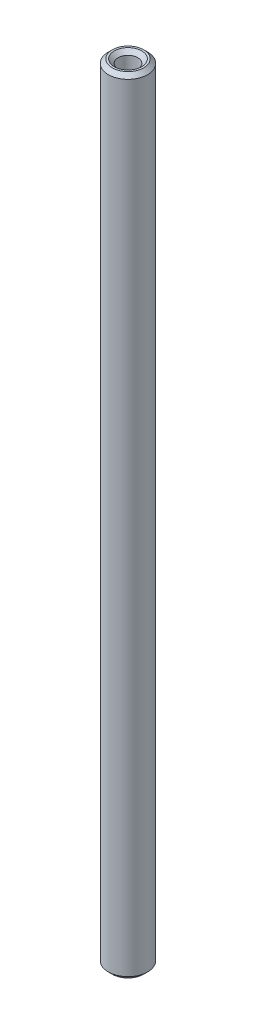
ISO-10303-21;
HEADER;
FILE_DESCRIPTION(('STEP AP214'),'2;1');
FILE_NAME('part.step','',(''),(''),'','','');
FILE_SCHEMA(('AUTOMOTIVE_DESIGN { 1 0 10303 214 1 1 1 1 }'));
ENDSEC;
DATA;
#1=APPLICATION_CONTEXT('core data for automotive mechanical design processes');
#2=APPLICATION_PROTOCOL_DEFINITION('international standard','automotive_design',2000,#1);
#3=PRODUCT_CONTEXT('',#1,'mechanical');
#4=PRODUCT('Part','Part','',(#3));
#5=PRODUCT_RELATED_PRODUCT_CATEGORY('part','',(#4));
#6=PRODUCT_DEFINITION_FORMATION('','',#4);
#7=PRODUCT_DEFINITION_CONTEXT('part definition',#1,'design');
#8=PRODUCT_DEFINITION('design','',#6,#7);
#9=PRODUCT_DEFINITION_SHAPE('','',#8);
#10=(LENGTH_UNIT() NAMED_UNIT(*) SI_UNIT(.MILLI.,.METRE.));
#11=(NAMED_UNIT(*) PLANE_ANGLE_UNIT() SI_UNIT($,.RADIAN.));
#12=(NAMED_UNIT(*) SI_UNIT($,.STERADIAN.) SOLID_ANGLE_UNIT());
#13=UNCERTAINTY_MEASURE_WITH_UNIT(LENGTH_MEASURE(1.E-05),#10,'distance_accuracy_value','');
#14=(GEOMETRIC_REPRESENTATION_CONTEXT(3) GLOBAL_UNCERTAINTY_ASSIGNED_CONTEXT((#13)) GLOBAL_UNIT_ASSIGNED_CONTEXT((#10,
#11,#12)) REPRESENTATION_CONTEXT('',''));
#15=CARTESIAN_POINT('',(0.,0.,0.));
#16=DIRECTION('',(0.,0.,1.));
#17=DIRECTION('',(1.,0.,0.));
#18=AXIS2_PLACEMENT_3D('',#15,#16,#17);
#19=CARTESIAN_POINT('',(0.,50.,0.));
#20=DIRECTION('',(0.,1.,0.));
#21=DIRECTION('',(0.,0.,1.));
#22=AXIS2_PLACEMENT_3D('',#19,#20,#21);
#23=PLANE('',#22);
#24=CARTESIAN_POINT('',(0.,50.,0.));
#25=DIRECTION('',(0.,1.,0.));
#26=DIRECTION('',(0.,0.,1.));
#27=AXIS2_PLACEMENT_3D('',#24,#25,#26);
#28=CIRCLE('',#27,1.75);
#29=CARTESIAN_POINT('',(0.,50.,1.75));
#30=VERTEX_POINT('',#29);
#31=EDGE_CURVE('E10',#30,#30,#28,.F.);
#32=ORIENTED_EDGE('',*,*,#31,.T.);
#33=EDGE_LOOP('',(#32));
#34=FACE_BOUND('',#33,.T.);
#35=CARTESIAN_POINT('',(0.,50.,0.));
#36=DIRECTION('',(0.,1.,0.));
#37=DIRECTION('',(0.,0.,1.));
#38=AXIS2_PLACEMENT_3D('',#35,#36,#37);
#39=CIRCLE('',#38,2.);
#40=CARTESIAN_POINT('',(0.,50.,2.));
#41=VERTEX_POINT('',#40);
#42=EDGE_CURVE('E48',#41,#41,#39,.T.);
#43=ORIENTED_EDGE('',*,*,#42,.T.);
#44=EDGE_LOOP('',(#43));
#45=FACE_BOUND('',#44,.T.);
#46=ADVANCED_FACE('F40',(#34,#45),#23,.T.);
#47=CARTESIAN_POINT('',(0.,-50.,0.));
#48=DIRECTION('',(0.,1.,0.));
#49=DIRECTION('',(0.,0.,1.));
#50=AXIS2_PLACEMENT_3D('',#47,#48,#49);
#51=PLANE('',#50);
#52=CARTESIAN_POINT('',(0.,-50.,0.));
#53=DIRECTION('',(0.,1.,0.));
#54=DIRECTION('',(0.,0.,1.));
#55=AXIS2_PLACEMENT_3D('',#52,#53,#54);
#56=CIRCLE('',#55,1.75);
#57=CARTESIAN_POINT('',(0.,-50.,1.75));
#58=VERTEX_POINT('',#57);
#59=EDGE_CURVE('E67',#58,#58,#56,.T.);
#60=ORIENTED_EDGE('',*,*,#59,.T.);
#61=EDGE_LOOP('',(#60));
#62=FACE_BOUND('',#61,.T.);
#63=CARTESIAN_POINT('',(0.,-50.,0.));
#64=DIRECTION('',(0.,1.,0.));
#65=DIRECTION('',(0.,0.,1.));
#66=AXIS2_PLACEMENT_3D('',#63,#64,#65);
#67=CIRCLE('',#66,2.);
#68=CARTESIAN_POINT('',(0.,-50.,2.));
#69=VERTEX_POINT('',#68);
#70=EDGE_CURVE('E70',#69,#69,#67,.F.);
#71=ORIENTED_EDGE('',*,*,#70,.T.);
#72=EDGE_LOOP('',(#71));
#73=FACE_BOUND('',#72,.T.);
#74=ADVANCED_FACE('F74',(#62,#73),#51,.F.);
#75=CARTESIAN_POINT('',(0.,50.,0.));
#76=DIRECTION('',(0.,-1.,0.));
#77=DIRECTION('',(0.,0.,-1.));
#78=AXIS2_PLACEMENT_3D('',#75,#76,#77);
#79=CYLINDRICAL_SURFACE('',#78,2.5);
#80=CARTESIAN_POINT('',(0.,-49.5,0.));
#81=DIRECTION('',(0.,1.,0.));
#82=DIRECTION('',(0.,0.,1.));
#83=AXIS2_PLACEMENT_3D('',#80,#81,#82);
#84=CIRCLE('',#83,2.5);
#85=CARTESIAN_POINT('',(0.,-49.5,2.5));
#86=VERTEX_POINT('',#85);
#87=EDGE_CURVE('E52',#86,#86,#84,.T.);
#88=ORIENTED_EDGE('',*,*,#87,.T.);
#89=EDGE_LOOP('',(#88));
#90=FACE_BOUND('',#89,.T.);
#91=CARTESIAN_POINT('',(0.,49.5,0.));
#92=DIRECTION('',(0.,1.,0.));
#93=DIRECTION('',(0.,0.,1.));
#94=AXIS2_PLACEMENT_3D('',#91,#92,#93);
#95=CIRCLE('',#94,2.5);
#96=CARTESIAN_POINT('',(0.,49.5,2.5));
#97=VERTEX_POINT('',#96);
#98=EDGE_CURVE('E56',#97,#97,#95,.F.);
#99=ORIENTED_EDGE('',*,*,#98,.T.);
#100=EDGE_LOOP('',(#99));
#101=FACE_BOUND('',#100,.T.);
#102=ADVANCED_FACE('F84',(#90,#101),#79,.T.);
#103=CARTESIAN_POINT('',(0.,50.,0.));
#104=DIRECTION('',(0.,-1.,0.));
#105=DIRECTION('',(0.,0.,-1.));
#106=AXIS2_PLACEMENT_3D('',#103,#104,#105);
#107=CYLINDRICAL_SURFACE('',#106,1.25);
#108=CARTESIAN_POINT('',(0.,-49.5,0.));
#109=DIRECTION('',(0.,1.,0.));
#110=DIRECTION('',(0.,0.,1.));
#111=AXIS2_PLACEMENT_3D('',#108,#109,#110);
#112=CIRCLE('',#111,1.25);
#113=CARTESIAN_POINT('',(0.,-49.5,1.25));
#114=VERTEX_POINT('',#113);
#115=EDGE_CURVE('E61',#114,#114,#112,.F.);
#116=ORIENTED_EDGE('',*,*,#115,.T.);
#117=EDGE_LOOP('',(#116));
#118=FACE_BOUND('',#117,.T.);
#119=CARTESIAN_POINT('',(0.,49.5,0.));
#120=DIRECTION('',(0.,1.,0.));
#121=DIRECTION('',(0.,0.,1.));
#122=AXIS2_PLACEMENT_3D('',#119,#120,#121);
#123=CIRCLE('',#122,1.25);
#124=CARTESIAN_POINT('',(0.,49.5,1.25));
#125=VERTEX_POINT('',#124);
#126=EDGE_CURVE('E64',#125,#125,#123,.T.);
#127=ORIENTED_EDGE('',*,*,#126,.T.);
#128=EDGE_LOOP('',(#127));
#129=FACE_BOUND('',#128,.T.);
#130=ADVANCED_FACE('F87',(#118,#129),#107,.F.);
#131=CARTESIAN_POINT('',(0.,-50.,0.));
#132=DIRECTION('',(0.,-1.,0.));
#133=DIRECTION('',(0.,0.,-1.));
#134=AXIS2_PLACEMENT_3D('',#131,#132,#133);
#135=CONICAL_SURFACE('',#134,1.75,0.785398163397449);
#136=ORIENTED_EDGE('',*,*,#115,.F.);
#137=EDGE_LOOP('',(#136));
#138=FACE_BOUND('',#137,.T.);
#139=ORIENTED_EDGE('',*,*,#59,.F.);
#140=EDGE_LOOP('',(#139));
#141=FACE_BOUND('',#140,.T.);
#142=ADVANCED_FACE('F80',(#138,#141),#135,.F.);
#143=CARTESIAN_POINT('',(0.,-49.5,0.));
#144=DIRECTION('',(0.,1.,0.));
#145=DIRECTION('',(0.,0.,1.));
#146=AXIS2_PLACEMENT_3D('',#143,#144,#145);
#147=CONICAL_SURFACE('',#146,2.5,0.785398163397446);
#148=ORIENTED_EDGE('',*,*,#70,.F.);
#149=EDGE_LOOP('',(#148));
#150=FACE_BOUND('',#149,.T.);
#151=ORIENTED_EDGE('',*,*,#87,.F.);
#152=EDGE_LOOP('',(#151));
#153=FACE_BOUND('',#152,.T.);
#154=ADVANCED_FACE('F76',(#150,#153),#147,.T.);
#155=CARTESIAN_POINT('',(0.,49.5,0.));
#156=DIRECTION('',(0.,1.,0.));
#157=DIRECTION('',(0.,0.,1.));
#158=AXIS2_PLACEMENT_3D('',#155,#156,#157);
#159=CONICAL_SURFACE('',#158,1.25,0.785398163397436);
#160=ORIENTED_EDGE('',*,*,#31,.F.);
#161=EDGE_LOOP('',(#160));
#162=FACE_BOUND('',#161,.T.);
#163=ORIENTED_EDGE('',*,*,#126,.F.);
#164=EDGE_LOOP('',(#163));
#165=FACE_BOUND('',#164,.T.);
#166=ADVANCED_FACE('F79',(#162,#165),#159,.F.);
#167=CARTESIAN_POINT('',(0.,50.,0.));
#168=DIRECTION('',(0.,-1.,0.));
#169=DIRECTION('',(0.,0.,-1.));
#170=AXIS2_PLACEMENT_3D('',#167,#168,#169);
#171=CONICAL_SURFACE('',#170,2.,0.785398163397453);
#172=ORIENTED_EDGE('',*,*,#98,.F.);
#173=EDGE_LOOP('',(#172));
#174=FACE_BOUND('',#173,.T.);
#175=ORIENTED_EDGE('',*,*,#42,.F.);
#176=EDGE_LOOP('',(#175));
#177=FACE_BOUND('',#176,.T.);
#178=ADVANCED_FACE('F43',(#174,#177),#171,.T.);
#179=CLOSED_SHELL('',(#46,#74,#102,#130,#142,#154,#166,#178));
#180=MANIFOLD_SOLID_BREP('B2',#179);
#181=ADVANCED_BREP_SHAPE_REPRESENTATION('',(#18,#180),#14);
#182=SHAPE_DEFINITION_REPRESENTATION(#9,#181);
ENDSEC;
END-ISO-10303-21;
